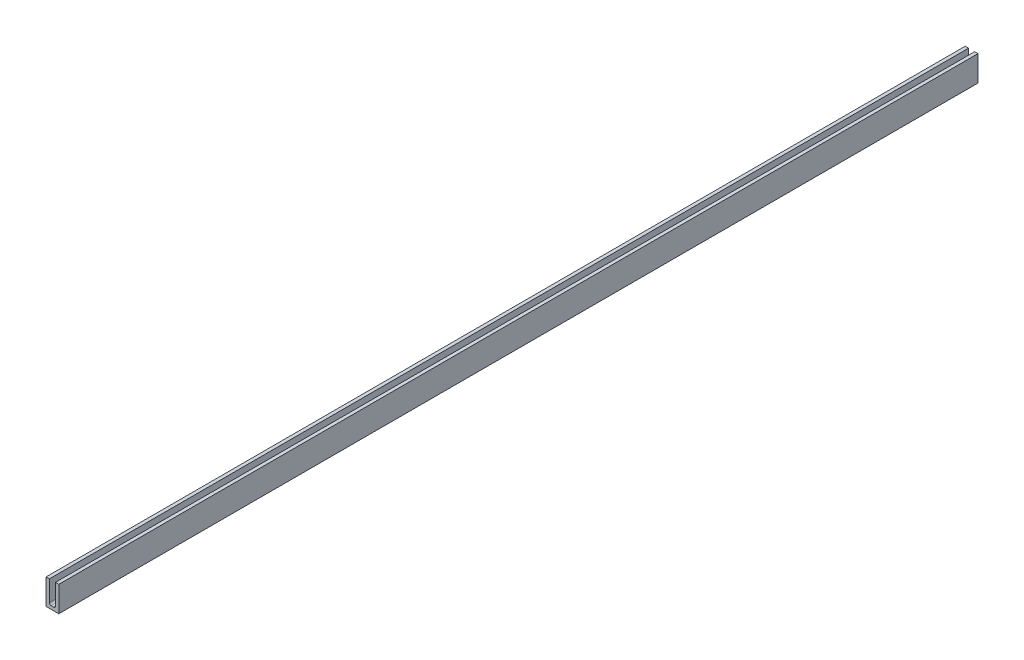
ISO-10303-21;
HEADER;
FILE_DESCRIPTION(('STEP AP214'),'2;1');
FILE_NAME('part.step','',(''),(''),'','','');
FILE_SCHEMA(('AUTOMOTIVE_DESIGN { 1 0 10303 214 1 1 1 1 }'));
ENDSEC;
DATA;
#1=APPLICATION_CONTEXT('core data for automotive mechanical design processes');
#2=APPLICATION_PROTOCOL_DEFINITION('international standard','automotive_design',2000,#1);
#3=PRODUCT_CONTEXT('',#1,'mechanical');
#4=PRODUCT('Part','Part','',(#3));
#5=PRODUCT_RELATED_PRODUCT_CATEGORY('part','',(#4));
#6=PRODUCT_DEFINITION_FORMATION('','',#4);
#7=PRODUCT_DEFINITION_CONTEXT('part definition',#1,'design');
#8=PRODUCT_DEFINITION('design','',#6,#7);
#9=PRODUCT_DEFINITION_SHAPE('','',#8);
#10=(LENGTH_UNIT() NAMED_UNIT(*) SI_UNIT(.MILLI.,.METRE.));
#11=(NAMED_UNIT(*) PLANE_ANGLE_UNIT() SI_UNIT($,.RADIAN.));
#12=(NAMED_UNIT(*) SI_UNIT($,.STERADIAN.) SOLID_ANGLE_UNIT());
#13=UNCERTAINTY_MEASURE_WITH_UNIT(LENGTH_MEASURE(1.E-05),#10,'distance_accuracy_value','');
#14=(GEOMETRIC_REPRESENTATION_CONTEXT(3) GLOBAL_UNCERTAINTY_ASSIGNED_CONTEXT((#13)) GLOBAL_UNIT_ASSIGNED_CONTEXT((#10,
#11,#12)) REPRESENTATION_CONTEXT('',''));
#15=CARTESIAN_POINT('',(0.,0.,0.));
#16=DIRECTION('',(0.,0.,1.));
#17=DIRECTION('',(1.,0.,0.));
#18=AXIS2_PLACEMENT_3D('',#15,#16,#17);
#19=CARTESIAN_POINT('',(-3.048,12.7,457.2));
#20=DIRECTION('',(0.,-1.,0.));
#21=DIRECTION('',(0.,0.,-1.));
#22=AXIS2_PLACEMENT_3D('',#19,#20,#21);
#23=PLANE('',#22);
#24=DIRECTION('',(-1.,0.,0.));
#25=VECTOR('',#24,1.);
#26=CARTESIAN_POINT('',(-3.048,12.7,-457.2));
#27=LINE('',#26,#25);
#28=CARTESIAN_POINT('',(-3.048,12.7,-457.2));
#29=VERTEX_POINT('',#28);
#30=CARTESIAN_POINT('',(-6.35,12.7,-457.2));
#31=VERTEX_POINT('',#30);
#32=EDGE_CURVE('E129',#29,#31,#27,.T.);
#33=ORIENTED_EDGE('',*,*,#32,.T.);
#34=DIRECTION('',(0.,0.,-1.));
#35=VECTOR('',#34,1.);
#36=CARTESIAN_POINT('',(-6.35,12.7,457.2));
#37=LINE('',#36,#35);
#38=CARTESIAN_POINT('',(-6.35,12.7,457.2));
#39=VERTEX_POINT('',#38);
#40=EDGE_CURVE('E112',#39,#31,#37,.T.);
#41=ORIENTED_EDGE('',*,*,#40,.F.);
#42=DIRECTION('',(-1.,0.,0.));
#43=VECTOR('',#42,1.);
#44=CARTESIAN_POINT('',(-3.048,12.7,457.2));
#45=LINE('',#44,#43);
#46=CARTESIAN_POINT('',(-3.048,12.7,457.2));
#47=VERTEX_POINT('',#46);
#48=EDGE_CURVE('E118',#47,#39,#45,.T.);
#49=ORIENTED_EDGE('',*,*,#48,.F.);
#50=DIRECTION('',(0.,0.,-1.));
#51=VECTOR('',#50,1.);
#52=CARTESIAN_POINT('',(-3.048,12.7,457.2));
#53=LINE('',#52,#51);
#54=EDGE_CURVE('E161',#47,#29,#53,.T.);
#55=ORIENTED_EDGE('',*,*,#54,.T.);
#56=EDGE_LOOP('',(#33,#41,#49,#55));
#57=FACE_BOUND('',#56,.T.);
#58=ADVANCED_FACE('F32',(#57),#23,.F.);
#59=CARTESIAN_POINT('',(-6.35,12.7,457.2));
#60=DIRECTION('',(1.,0.,0.));
#61=DIRECTION('',(0.,0.,-1.));
#62=AXIS2_PLACEMENT_3D('',#59,#60,#61);
#63=PLANE('',#62);
#64=DIRECTION('',(0.,-1.,0.));
#65=VECTOR('',#64,1.);
#66=CARTESIAN_POINT('',(-6.35,12.7,-457.2));
#67=LINE('',#66,#65);
#68=CARTESIAN_POINT('',(-6.35,-12.7,-457.2));
#69=VERTEX_POINT('',#68);
#70=EDGE_CURVE('E171',#31,#69,#67,.T.);
#71=ORIENTED_EDGE('',*,*,#70,.T.);
#72=DIRECTION('',(0.,0.,-1.));
#73=VECTOR('',#72,1.);
#74=CARTESIAN_POINT('',(-6.35,-12.7,457.2));
#75=LINE('',#74,#73);
#76=CARTESIAN_POINT('',(-6.35,-12.7,457.2));
#77=VERTEX_POINT('',#76);
#78=EDGE_CURVE('E115',#77,#69,#75,.T.);
#79=ORIENTED_EDGE('',*,*,#78,.F.);
#80=DIRECTION('',(0.,-1.,0.));
#81=VECTOR('',#80,1.);
#82=CARTESIAN_POINT('',(-6.35,12.7,457.2));
#83=LINE('',#82,#81);
#84=EDGE_CURVE('E108',#39,#77,#83,.T.);
#85=ORIENTED_EDGE('',*,*,#84,.F.);
#86=ORIENTED_EDGE('',*,*,#40,.T.);
#87=EDGE_LOOP('',(#71,#79,#85,#86));
#88=FACE_BOUND('',#87,.T.);
#89=ADVANCED_FACE('F110',(#88),#63,.F.);
#90=CARTESIAN_POINT('',(-6.35,-12.7,457.2));
#91=DIRECTION('',(0.,1.,0.));
#92=DIRECTION('',(-1.,0.,0.));
#93=AXIS2_PLACEMENT_3D('',#90,#91,#92);
#94=PLANE('',#93);
#95=DIRECTION('',(1.,0.,0.));
#96=VECTOR('',#95,1.);
#97=CARTESIAN_POINT('',(-6.35,-12.7,-457.2));
#98=LINE('',#97,#96);
#99=CARTESIAN_POINT('',(6.35,-12.7,-457.2));
#100=VERTEX_POINT('',#99);
#101=EDGE_CURVE('E173',#69,#100,#98,.T.);
#102=ORIENTED_EDGE('',*,*,#101,.T.);
#103=DIRECTION('',(0.,0.,-1.));
#104=VECTOR('',#103,1.);
#105=CARTESIAN_POINT('',(6.35,-12.7,457.2));
#106=LINE('',#105,#104);
#107=CARTESIAN_POINT('',(6.35,-12.7,457.2));
#108=VERTEX_POINT('',#107);
#109=EDGE_CURVE('E134',#108,#100,#106,.T.);
#110=ORIENTED_EDGE('',*,*,#109,.F.);
#111=DIRECTION('',(1.,0.,0.));
#112=VECTOR('',#111,1.);
#113=CARTESIAN_POINT('',(-6.35,-12.7,457.2));
#114=LINE('',#113,#112);
#115=EDGE_CURVE('E117',#77,#108,#114,.T.);
#116=ORIENTED_EDGE('',*,*,#115,.F.);
#117=ORIENTED_EDGE('',*,*,#78,.T.);
#118=EDGE_LOOP('',(#102,#110,#116,#117));
#119=FACE_BOUND('',#118,.T.);
#120=ADVANCED_FACE('F212',(#119),#94,.F.);
#121=CARTESIAN_POINT('',(6.35,-12.7,457.2));
#122=DIRECTION('',(-1.,0.,0.));
#123=DIRECTION('',(0.,-1.,0.));
#124=AXIS2_PLACEMENT_3D('',#121,#122,#123);
#125=PLANE('',#124);
#126=DIRECTION('',(0.,1.,0.));
#127=VECTOR('',#126,1.);
#128=CARTESIAN_POINT('',(6.35,-12.7,-457.2));
#129=LINE('',#128,#127);
#130=CARTESIAN_POINT('',(6.35,12.7,-457.2));
#131=VERTEX_POINT('',#130);
#132=EDGE_CURVE('E175',#100,#131,#129,.T.);
#133=ORIENTED_EDGE('',*,*,#132,.T.);
#134=DIRECTION('',(0.,0.,-1.));
#135=VECTOR('',#134,1.);
#136=CARTESIAN_POINT('',(6.35,12.7,457.2));
#137=LINE('',#136,#135);
#138=CARTESIAN_POINT('',(6.35,12.7,457.2));
#139=VERTEX_POINT('',#138);
#140=EDGE_CURVE('E184',#139,#131,#137,.T.);
#141=ORIENTED_EDGE('',*,*,#140,.F.);
#142=DIRECTION('',(0.,1.,0.));
#143=VECTOR('',#142,1.);
#144=CARTESIAN_POINT('',(6.35,-12.7,457.2));
#145=LINE('',#144,#143);
#146=EDGE_CURVE('E193',#108,#139,#145,.T.);
#147=ORIENTED_EDGE('',*,*,#146,.F.);
#148=ORIENTED_EDGE('',*,*,#109,.T.);
#149=EDGE_LOOP('',(#133,#141,#147,#148));
#150=FACE_BOUND('',#149,.T.);
#151=ADVANCED_FACE('F191',(#150),#125,.F.);
#152=CARTESIAN_POINT('',(6.35,12.7,457.2));
#153=DIRECTION('',(0.,-1.,0.));
#154=DIRECTION('',(1.,0.,0.));
#155=AXIS2_PLACEMENT_3D('',#152,#153,#154);
#156=PLANE('',#155);
#157=DIRECTION('',(-1.,0.,0.));
#158=VECTOR('',#157,1.);
#159=CARTESIAN_POINT('',(6.35,12.7,-457.2));
#160=LINE('',#159,#158);
#161=CARTESIAN_POINT('',(3.048,12.7,-457.2));
#162=VERTEX_POINT('',#161);
#163=EDGE_CURVE('E177',#131,#162,#160,.T.);
#164=ORIENTED_EDGE('',*,*,#163,.T.);
#165=DIRECTION('',(0.,0.,-1.));
#166=VECTOR('',#165,1.);
#167=CARTESIAN_POINT('',(3.048,12.7,457.2));
#168=LINE('',#167,#166);
#169=CARTESIAN_POINT('',(3.048,12.7,457.2));
#170=VERTEX_POINT('',#169);
#171=EDGE_CURVE('E164',#170,#162,#168,.T.);
#172=ORIENTED_EDGE('',*,*,#171,.F.);
#173=DIRECTION('',(-1.,0.,0.));
#174=VECTOR('',#173,1.);
#175=CARTESIAN_POINT('',(6.35,12.7,457.2));
#176=LINE('',#175,#174);
#177=EDGE_CURVE('E208',#139,#170,#176,.T.);
#178=ORIENTED_EDGE('',*,*,#177,.F.);
#179=ORIENTED_EDGE('',*,*,#140,.T.);
#180=EDGE_LOOP('',(#164,#172,#178,#179));
#181=FACE_BOUND('',#180,.T.);
#182=ADVANCED_FACE('F200',(#181),#156,.F.);
#183=CARTESIAN_POINT('',(3.048,12.7,457.2));
#184=DIRECTION('',(1.,0.,0.));
#185=DIRECTION('',(0.,0.,-1.));
#186=AXIS2_PLACEMENT_3D('',#183,#184,#185);
#187=PLANE('',#186);
#188=DIRECTION('',(0.,-1.,0.));
#189=VECTOR('',#188,1.);
#190=CARTESIAN_POINT('',(3.048,12.7,-457.2));
#191=LINE('',#190,#189);
#192=CARTESIAN_POINT('',(3.048,-7.747,-457.2));
#193=VERTEX_POINT('',#192);
#194=EDGE_CURVE('E157',#162,#193,#191,.T.);
#195=ORIENTED_EDGE('',*,*,#194,.T.);
#196=DIRECTION('',(0.,0.,-1.));
#197=VECTOR('',#196,1.);
#198=CARTESIAN_POINT('',(3.048,-7.747,457.2));
#199=LINE('',#198,#197);
#200=CARTESIAN_POINT('',(3.048,-7.747,457.2));
#201=VERTEX_POINT('',#200);
#202=EDGE_CURVE('E140',#193,#201,#199,.F.);
#203=ORIENTED_EDGE('',*,*,#202,.T.);
#204=DIRECTION('',(0.,-1.,0.));
#205=VECTOR('',#204,1.);
#206=CARTESIAN_POINT('',(3.048,12.7,457.2));
#207=LINE('',#206,#205);
#208=EDGE_CURVE('E166',#170,#201,#207,.T.);
#209=ORIENTED_EDGE('',*,*,#208,.F.);
#210=ORIENTED_EDGE('',*,*,#171,.T.);
#211=EDGE_LOOP('',(#195,#203,#209,#210));
#212=FACE_BOUND('',#211,.T.);
#213=ADVANCED_FACE('F204',(#212),#187,.F.);
#214=CARTESIAN_POINT('',(3.048,-9.398,457.2));
#215=DIRECTION('',(0.,-1.,0.));
#216=DIRECTION('',(0.,0.,-1.));
#217=AXIS2_PLACEMENT_3D('',#214,#215,#216);
#218=PLANE('',#217);
#219=DIRECTION('',(-1.,0.,0.));
#220=VECTOR('',#219,1.);
#221=CARTESIAN_POINT('',(3.048,-9.398,457.2));
#222=LINE('',#221,#220);
#223=CARTESIAN_POINT('',(1.397,-9.398,457.2));
#224=VERTEX_POINT('',#223);
#225=CARTESIAN_POINT('',(-1.397,-9.398,457.2));
#226=VERTEX_POINT('',#225);
#227=EDGE_CURVE('E162',#224,#226,#222,.T.);
#228=ORIENTED_EDGE('',*,*,#227,.F.);
#229=DIRECTION('',(0.,0.,-1.));
#230=VECTOR('',#229,1.);
#231=CARTESIAN_POINT('',(1.397,-9.398,-457.2));
#232=LINE('',#231,#230);
#233=CARTESIAN_POINT('',(1.397,-9.398,-457.2));
#234=VERTEX_POINT('',#233);
#235=EDGE_CURVE('E132',#224,#234,#232,.T.);
#236=ORIENTED_EDGE('',*,*,#235,.T.);
#237=DIRECTION('',(-1.,0.,0.));
#238=VECTOR('',#237,1.);
#239=CARTESIAN_POINT('',(3.048,-9.398,-457.2));
#240=LINE('',#239,#238);
#241=CARTESIAN_POINT('',(-1.397,-9.398,-457.2));
#242=VERTEX_POINT('',#241);
#243=EDGE_CURVE('E152',#234,#242,#240,.T.);
#244=ORIENTED_EDGE('',*,*,#243,.T.);
#245=DIRECTION('',(0.,0.,-1.));
#246=VECTOR('',#245,1.);
#247=CARTESIAN_POINT('',(-1.397,-9.398,457.2));
#248=LINE('',#247,#246);
#249=EDGE_CURVE('E130',#242,#226,#248,.F.);
#250=ORIENTED_EDGE('',*,*,#249,.T.);
#251=EDGE_LOOP('',(#228,#236,#244,#250));
#252=FACE_BOUND('',#251,.T.);
#253=ADVANCED_FACE('F155',(#252),#218,.F.);
#254=CARTESIAN_POINT('',(-3.048,-9.398,457.2));
#255=DIRECTION('',(-1.,0.,0.));
#256=DIRECTION('',(0.,-1.,0.));
#257=AXIS2_PLACEMENT_3D('',#254,#255,#256);
#258=PLANE('',#257);
#259=DIRECTION('',(0.,1.,0.));
#260=VECTOR('',#259,1.);
#261=CARTESIAN_POINT('',(-3.048,-9.398,457.2));
#262=LINE('',#261,#260);
#263=CARTESIAN_POINT('',(-3.048,-7.747,457.2));
#264=VERTEX_POINT('',#263);
#265=EDGE_CURVE('E122',#264,#47,#262,.T.);
#266=ORIENTED_EDGE('',*,*,#265,.F.);
#267=DIRECTION('',(0.,0.,-1.));
#268=VECTOR('',#267,1.);
#269=CARTESIAN_POINT('',(-3.048,-7.747,-457.2));
#270=LINE('',#269,#268);
#271=CARTESIAN_POINT('',(-3.048,-7.747,-457.2));
#272=VERTEX_POINT('',#271);
#273=EDGE_CURVE('E142',#264,#272,#270,.T.);
#274=ORIENTED_EDGE('',*,*,#273,.T.);
#275=DIRECTION('',(0.,1.,0.));
#276=VECTOR('',#275,1.);
#277=CARTESIAN_POINT('',(-3.048,-9.398,-457.2));
#278=LINE('',#277,#276);
#279=EDGE_CURVE('E126',#272,#29,#278,.T.);
#280=ORIENTED_EDGE('',*,*,#279,.T.);
#281=ORIENTED_EDGE('',*,*,#54,.F.);
#282=EDGE_LOOP('',(#266,#274,#280,#281));
#283=FACE_BOUND('',#282,.T.);
#284=ADVANCED_FACE('F160',(#283),#258,.F.);
#285=CARTESIAN_POINT('',(0.,0.,457.2));
#286=DIRECTION('',(0.,0.,1.));
#287=DIRECTION('',(1.,0.,0.));
#288=AXIS2_PLACEMENT_3D('',#285,#286,#287);
#289=PLANE('',#288);
#290=ORIENTED_EDGE('',*,*,#48,.T.);
#291=ORIENTED_EDGE('',*,*,#84,.T.);
#292=ORIENTED_EDGE('',*,*,#115,.T.);
#293=ORIENTED_EDGE('',*,*,#146,.T.);
#294=ORIENTED_EDGE('',*,*,#177,.T.);
#295=ORIENTED_EDGE('',*,*,#208,.T.);
#296=CARTESIAN_POINT('',(1.397,-7.747,457.2));
#297=DIRECTION('',(0.,0.,1.));
#298=DIRECTION('',(1.,0.,0.));
#299=AXIS2_PLACEMENT_3D('',#296,#297,#298);
#300=CIRCLE('',#299,1.651);
#301=EDGE_CURVE('E146',#201,#224,#300,.F.);
#302=ORIENTED_EDGE('',*,*,#301,.T.);
#303=ORIENTED_EDGE('',*,*,#227,.T.);
#304=CARTESIAN_POINT('',(-1.397,-7.747,457.2));
#305=DIRECTION('',(0.,0.,1.));
#306=DIRECTION('',(1.,0.,0.));
#307=AXIS2_PLACEMENT_3D('',#304,#305,#306);
#308=CIRCLE('',#307,1.651);
#309=EDGE_CURVE('E11',#226,#264,#308,.F.);
#310=ORIENTED_EDGE('',*,*,#309,.T.);
#311=ORIENTED_EDGE('',*,*,#265,.T.);
#312=EDGE_LOOP('',(#290,#291,#292,#293,#294,#295,#302,#303,#310,#311));
#313=FACE_BOUND('',#312,.T.);
#314=ADVANCED_FACE('F121',(#313),#289,.T.);
#315=CARTESIAN_POINT('',(0.,0.,-457.2));
#316=DIRECTION('',(0.,0.,1.));
#317=DIRECTION('',(1.,0.,0.));
#318=AXIS2_PLACEMENT_3D('',#315,#316,#317);
#319=PLANE('',#318);
#320=ORIENTED_EDGE('',*,*,#32,.F.);
#321=ORIENTED_EDGE('',*,*,#279,.F.);
#322=CARTESIAN_POINT('',(-1.397,-7.747,-457.2));
#323=DIRECTION('',(0.,0.,1.));
#324=DIRECTION('',(1.,0.,0.));
#325=AXIS2_PLACEMENT_3D('',#322,#323,#324);
#326=CIRCLE('',#325,1.651);
#327=EDGE_CURVE('E40',#272,#242,#326,.T.);
#328=ORIENTED_EDGE('',*,*,#327,.T.);
#329=ORIENTED_EDGE('',*,*,#243,.F.);
#330=CARTESIAN_POINT('',(1.397,-7.747,-457.2));
#331=DIRECTION('',(0.,0.,1.));
#332=DIRECTION('',(1.,0.,0.));
#333=AXIS2_PLACEMENT_3D('',#330,#331,#332);
#334=CIRCLE('',#333,1.651);
#335=EDGE_CURVE('E144',#234,#193,#334,.T.);
#336=ORIENTED_EDGE('',*,*,#335,.T.);
#337=ORIENTED_EDGE('',*,*,#194,.F.);
#338=ORIENTED_EDGE('',*,*,#163,.F.);
#339=ORIENTED_EDGE('',*,*,#132,.F.);
#340=ORIENTED_EDGE('',*,*,#101,.F.);
#341=ORIENTED_EDGE('',*,*,#70,.F.);
#342=EDGE_LOOP('',(#320,#321,#328,#329,#336,#337,#338,#339,#340,#341));
#343=FACE_BOUND('',#342,.T.);
#344=ADVANCED_FACE('F151',(#343),#319,.F.);
#345=CARTESIAN_POINT('',(1.397,-7.747,457.2));
#346=DIRECTION('',(0.,0.,1.));
#347=DIRECTION('',(1.,0.,0.));
#348=AXIS2_PLACEMENT_3D('',#345,#346,#347);
#349=CYLINDRICAL_SURFACE('',#348,1.651);
#350=ORIENTED_EDGE('',*,*,#301,.F.);
#351=ORIENTED_EDGE('',*,*,#202,.F.);
#352=ORIENTED_EDGE('',*,*,#335,.F.);
#353=ORIENTED_EDGE('',*,*,#235,.F.);
#354=EDGE_LOOP('',(#350,#351,#352,#353));
#355=FACE_BOUND('',#354,.T.);
#356=ADVANCED_FACE('F225',(#355),#349,.F.);
#357=CARTESIAN_POINT('',(-1.397,-7.747,457.2));
#358=DIRECTION('',(0.,0.,1.));
#359=DIRECTION('',(1.,0.,0.));
#360=AXIS2_PLACEMENT_3D('',#357,#358,#359);
#361=CYLINDRICAL_SURFACE('',#360,1.651);
#362=ORIENTED_EDGE('',*,*,#309,.F.);
#363=ORIENTED_EDGE('',*,*,#249,.F.);
#364=ORIENTED_EDGE('',*,*,#327,.F.);
#365=ORIENTED_EDGE('',*,*,#273,.F.);
#366=EDGE_LOOP('',(#362,#363,#364,#365));
#367=FACE_BOUND('',#366,.T.);
#368=ADVANCED_FACE('F34',(#367),#361,.F.);
#369=CLOSED_SHELL('',(#58,#89,#120,#151,#182,#213,#253,#284,#314,#344,#356,#368));
#370=MANIFOLD_SOLID_BREP('B2',#369);
#371=ADVANCED_BREP_SHAPE_REPRESENTATION('',(#18,#370),#14);
#372=SHAPE_DEFINITION_REPRESENTATION(#9,#371);
ENDSEC;
END-ISO-10303-21;
